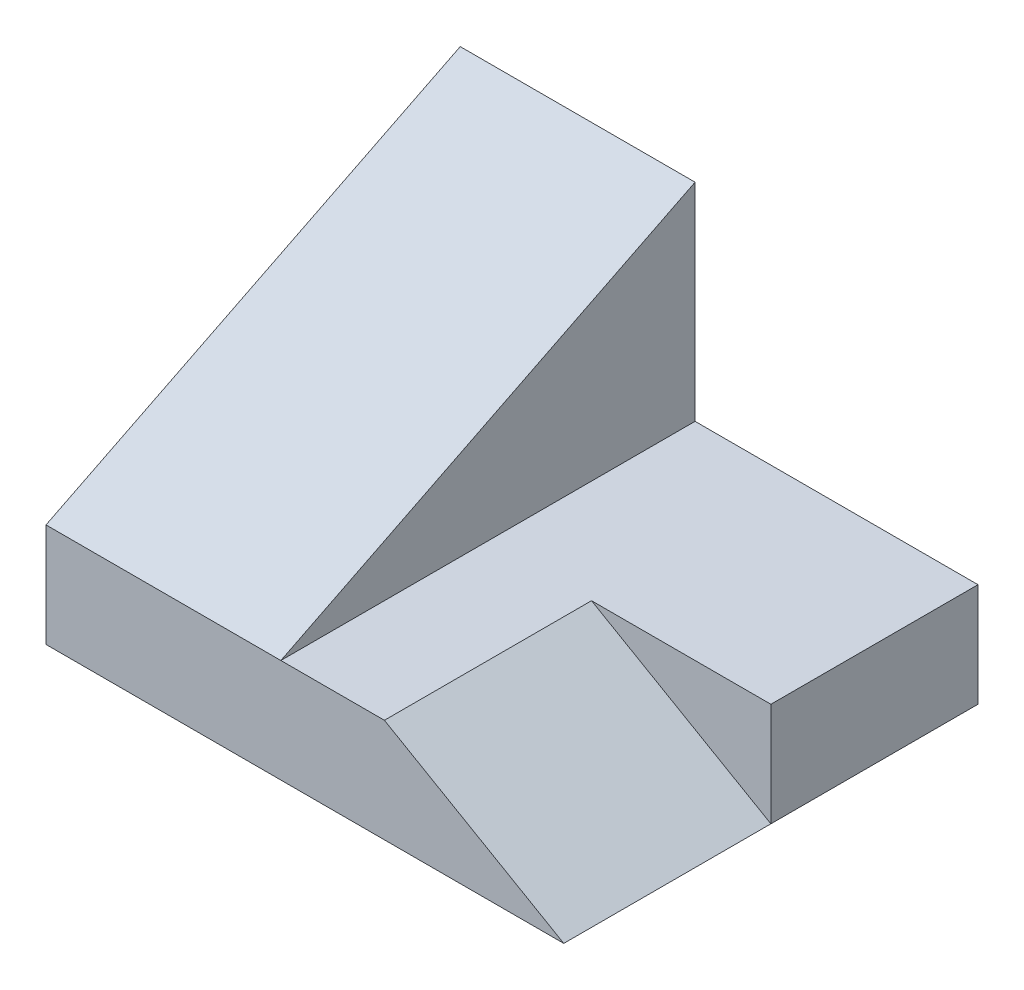
ISO-10303-21;
HEADER;
FILE_DESCRIPTION(('STEP AP214'),'2;1');
FILE_NAME('part.step','',(''),(''),'','','');
FILE_SCHEMA(('AUTOMOTIVE_DESIGN { 1 0 10303 214 1 1 1 1 }'));
ENDSEC;
DATA;
#1=APPLICATION_CONTEXT('core data for automotive mechanical design processes');
#2=APPLICATION_PROTOCOL_DEFINITION('international standard','automotive_design',2000,#1);
#3=PRODUCT_CONTEXT('',#1,'mechanical');
#4=PRODUCT('Part','Part','',(#3));
#5=PRODUCT_RELATED_PRODUCT_CATEGORY('part','',(#4));
#6=PRODUCT_DEFINITION_FORMATION('','',#4);
#7=PRODUCT_DEFINITION_CONTEXT('part definition',#1,'design');
#8=PRODUCT_DEFINITION('design','',#6,#7);
#9=PRODUCT_DEFINITION_SHAPE('','',#8);
#10=(LENGTH_UNIT() NAMED_UNIT(*) SI_UNIT(.MILLI.,.METRE.));
#11=(NAMED_UNIT(*) PLANE_ANGLE_UNIT() SI_UNIT($,.RADIAN.));
#12=(NAMED_UNIT(*) SI_UNIT($,.STERADIAN.) SOLID_ANGLE_UNIT());
#13=UNCERTAINTY_MEASURE_WITH_UNIT(LENGTH_MEASURE(1.E-05),#10,'distance_accuracy_value','');
#14=(GEOMETRIC_REPRESENTATION_CONTEXT(3) GLOBAL_UNCERTAINTY_ASSIGNED_CONTEXT((#13)) GLOBAL_UNIT_ASSIGNED_CONTEXT((#10,
#11,#12)) REPRESENTATION_CONTEXT('',''));
#15=CARTESIAN_POINT('',(0.,0.,0.));
#16=DIRECTION('',(0.,0.,1.));
#17=DIRECTION('',(1.,0.,0.));
#18=AXIS2_PLACEMENT_3D('',#15,#16,#17);
#19=CARTESIAN_POINT('',(0.,10.,-40.));
#20=DIRECTION('',(1.,0.,0.));
#21=DIRECTION('',(0.,0.,-1.));
#22=AXIS2_PLACEMENT_3D('',#19,#20,#21);
#23=PLANE('',#22);
#24=DIRECTION('',(0.,-1.,0.));
#25=VECTOR('',#24,1.);
#26=CARTESIAN_POINT('',(0.,10.,0.));
#27=LINE('',#26,#25);
#28=CARTESIAN_POINT('',(0.,10.,0.));
#29=VERTEX_POINT('',#28);
#30=CARTESIAN_POINT('',(0.,0.,0.));
#31=VERTEX_POINT('',#30);
#32=EDGE_CURVE('E11',#29,#31,#27,.T.);
#33=ORIENTED_EDGE('',*,*,#32,.F.);
#34=DIRECTION('',(0.,0.447213595499958,-0.894427190999916));
#35=VECTOR('',#34,1.);
#36=CARTESIAN_POINT('',(0.,26.,-32.));
#37=LINE('',#36,#35);
#38=CARTESIAN_POINT('',(0.,30.,-40.));
#39=VERTEX_POINT('',#38);
#40=EDGE_CURVE('E162',#29,#39,#37,.T.);
#41=ORIENTED_EDGE('',*,*,#40,.T.);
#42=DIRECTION('',(0.,-1.,0.));
#43=VECTOR('',#42,1.);
#44=CARTESIAN_POINT('',(0.,10.,-40.));
#45=LINE('',#44,#43);
#46=CARTESIAN_POINT('',(0.,0.,-40.));
#47=VERTEX_POINT('',#46);
#48=EDGE_CURVE('E91',#39,#47,#45,.T.);
#49=ORIENTED_EDGE('',*,*,#48,.T.);
#50=DIRECTION('',(0.,0.,1.));
#51=VECTOR('',#50,1.);
#52=CARTESIAN_POINT('',(0.,0.,-40.));
#53=LINE('',#52,#51);
#54=EDGE_CURVE('E96',#47,#31,#53,.T.);
#55=ORIENTED_EDGE('',*,*,#54,.T.);
#56=EDGE_LOOP('',(#33,#41,#49,#55));
#57=FACE_BOUND('',#56,.T.);
#58=ADVANCED_FACE('F39',(#57),#23,.F.);
#59=CARTESIAN_POINT('',(0.,10.,0.));
#60=DIRECTION('',(0.,0.,-1.));
#61=DIRECTION('',(-1.,0.,0.));
#62=AXIS2_PLACEMENT_3D('',#59,#60,#61);
#63=PLANE('',#62);
#64=DIRECTION('',(1.,0.,0.));
#65=VECTOR('',#64,1.);
#66=CARTESIAN_POINT('',(0.,10.,0.));
#67=LINE('',#66,#65);
#68=CARTESIAN_POINT('',(22.6794919243112,10.,0.));
#69=VERTEX_POINT('',#68);
#70=CARTESIAN_POINT('',(32.6794919243112,10.,0.));
#71=VERTEX_POINT('',#70);
#72=EDGE_CURVE('E97',#69,#71,#67,.T.);
#73=ORIENTED_EDGE('',*,*,#72,.F.);
#74=DIRECTION('',(1.,0.,0.));
#75=VECTOR('',#74,1.);
#76=CARTESIAN_POINT('',(-7.32050807568877,10.,0.));
#77=LINE('',#76,#75);
#78=EDGE_CURVE('E157',#29,#69,#77,.T.);
#79=ORIENTED_EDGE('',*,*,#78,.F.);
#80=ORIENTED_EDGE('',*,*,#32,.T.);
#81=DIRECTION('',(1.,0.,0.));
#82=VECTOR('',#81,1.);
#83=CARTESIAN_POINT('',(0.,0.,0.));
#84=LINE('',#83,#82);
#85=CARTESIAN_POINT('',(50.,0.,0.));
#86=VERTEX_POINT('',#85);
#87=EDGE_CURVE('E82',#31,#86,#84,.T.);
#88=ORIENTED_EDGE('',*,*,#87,.T.);
#89=DIRECTION('',(0.866025403784439,-0.5,0.));
#90=VECTOR('',#89,1.);
#91=CARTESIAN_POINT('',(32.6794919243112,10.,0.));
#92=LINE('',#91,#90);
#93=EDGE_CURVE('E118',#71,#86,#92,.T.);
#94=ORIENTED_EDGE('',*,*,#93,.F.);
#95=EDGE_LOOP('',(#73,#79,#80,#88,#94));
#96=FACE_BOUND('',#95,.T.);
#97=ADVANCED_FACE('F117',(#96),#63,.F.);
#98=CARTESIAN_POINT('',(50.,10.,0.));
#99=DIRECTION('',(-1.,0.,0.));
#100=DIRECTION('',(0.,0.,1.));
#101=AXIS2_PLACEMENT_3D('',#98,#99,#100);
#102=PLANE('',#101);
#103=DIRECTION('',(0.,0.,-1.));
#104=VECTOR('',#103,1.);
#105=CARTESIAN_POINT('',(50.,10.,0.));
#106=LINE('',#105,#104);
#107=CARTESIAN_POINT('',(50.,10.,-20.));
#108=VERTEX_POINT('',#107);
#109=CARTESIAN_POINT('',(50.,10.,-40.));
#110=VERTEX_POINT('',#109);
#111=EDGE_CURVE('E54',#108,#110,#106,.T.);
#112=ORIENTED_EDGE('',*,*,#111,.F.);
#113=DIRECTION('',(0.,1.,0.));
#114=VECTOR('',#113,1.);
#115=CARTESIAN_POINT('',(50.,0.,-20.));
#116=LINE('',#115,#114);
#117=CARTESIAN_POINT('',(50.,0.,-20.));
#118=VERTEX_POINT('',#117);
#119=EDGE_CURVE('E77',#118,#108,#116,.T.);
#120=ORIENTED_EDGE('',*,*,#119,.F.);
#121=DIRECTION('',(0.,0.,-1.));
#122=VECTOR('',#121,1.);
#123=CARTESIAN_POINT('',(50.,0.,0.));
#124=LINE('',#123,#122);
#125=CARTESIAN_POINT('',(50.,0.,-40.));
#126=VERTEX_POINT('',#125);
#127=EDGE_CURVE('E71',#118,#126,#124,.T.);
#128=ORIENTED_EDGE('',*,*,#127,.T.);
#129=DIRECTION('',(0.,-1.,0.));
#130=VECTOR('',#129,1.);
#131=CARTESIAN_POINT('',(50.,10.,-40.));
#132=LINE('',#131,#130);
#133=EDGE_CURVE('E47',#110,#126,#132,.T.);
#134=ORIENTED_EDGE('',*,*,#133,.F.);
#135=EDGE_LOOP('',(#112,#120,#128,#134));
#136=FACE_BOUND('',#135,.T.);
#137=ADVANCED_FACE('F73',(#136),#102,.F.);
#138=CARTESIAN_POINT('',(50.,10.,-40.));
#139=DIRECTION('',(0.,0.,1.));
#140=DIRECTION('',(1.,0.,0.));
#141=AXIS2_PLACEMENT_3D('',#138,#139,#140);
#142=PLANE('',#141);
#143=DIRECTION('',(-1.,0.,0.));
#144=VECTOR('',#143,1.);
#145=CARTESIAN_POINT('',(50.,0.,-40.));
#146=LINE('',#145,#144);
#147=EDGE_CURVE('E87',#126,#47,#146,.T.);
#148=ORIENTED_EDGE('',*,*,#147,.T.);
#149=ORIENTED_EDGE('',*,*,#48,.F.);
#150=DIRECTION('',(-1.,0.,0.));
#151=VECTOR('',#150,1.);
#152=CARTESIAN_POINT('',(0.,30.,-40.));
#153=LINE('',#152,#151);
#154=CARTESIAN_POINT('',(22.6794919243112,30.,-40.));
#155=VERTEX_POINT('',#154);
#156=EDGE_CURVE('E169',#155,#39,#153,.T.);
#157=ORIENTED_EDGE('',*,*,#156,.F.);
#158=DIRECTION('',(0.,-1.,0.));
#159=VECTOR('',#158,1.);
#160=CARTESIAN_POINT('',(22.6794919243112,30.,-40.));
#161=LINE('',#160,#159);
#162=CARTESIAN_POINT('',(22.6794919243112,10.,-40.));
#163=VERTEX_POINT('',#162);
#164=EDGE_CURVE('E140',#155,#163,#161,.T.);
#165=ORIENTED_EDGE('',*,*,#164,.T.);
#166=DIRECTION('',(-1.,0.,0.));
#167=VECTOR('',#166,1.);
#168=CARTESIAN_POINT('',(50.,10.,-40.));
#169=LINE('',#168,#167);
#170=EDGE_CURVE('E90',#110,#163,#169,.T.);
#171=ORIENTED_EDGE('',*,*,#170,.F.);
#172=ORIENTED_EDGE('',*,*,#133,.T.);
#173=EDGE_LOOP('',(#148,#149,#157,#165,#171,#172));
#174=FACE_BOUND('',#173,.T.);
#175=ADVANCED_FACE('F85',(#174),#142,.F.);
#176=CARTESIAN_POINT('',(0.,10.,0.));
#177=DIRECTION('',(0.,1.,0.));
#178=DIRECTION('',(0.,0.,1.));
#179=AXIS2_PLACEMENT_3D('',#176,#177,#178);
#180=PLANE('',#179);
#181=DIRECTION('',(0.,0.,-1.));
#182=VECTOR('',#181,1.);
#183=CARTESIAN_POINT('',(22.6794919243112,10.,-40.));
#184=LINE('',#183,#182);
#185=EDGE_CURVE('E166',#69,#163,#184,.T.);
#186=ORIENTED_EDGE('',*,*,#185,.F.);
#187=ORIENTED_EDGE('',*,*,#72,.T.);
#188=DIRECTION('',(0.,0.,1.));
#189=VECTOR('',#188,1.);
#190=CARTESIAN_POINT('',(32.6794919243112,10.,-20.));
#191=LINE('',#190,#189);
#192=CARTESIAN_POINT('',(32.6794919243112,10.,-20.));
#193=VERTEX_POINT('',#192);
#194=EDGE_CURVE('E112',#193,#71,#191,.T.);
#195=ORIENTED_EDGE('',*,*,#194,.F.);
#196=DIRECTION('',(-1.,0.,0.));
#197=VECTOR('',#196,1.);
#198=CARTESIAN_POINT('',(50.,10.,-20.));
#199=LINE('',#198,#197);
#200=EDGE_CURVE('E132',#108,#193,#199,.T.);
#201=ORIENTED_EDGE('',*,*,#200,.F.);
#202=ORIENTED_EDGE('',*,*,#111,.T.);
#203=ORIENTED_EDGE('',*,*,#170,.T.);
#204=EDGE_LOOP('',(#186,#187,#195,#201,#202,#203));
#205=FACE_BOUND('',#204,.T.);
#206=ADVANCED_FACE('F142',(#205),#180,.T.);
#207=CARTESIAN_POINT('',(0.,0.,0.));
#208=DIRECTION('',(0.,1.,0.));
#209=DIRECTION('',(0.,0.,1.));
#210=AXIS2_PLACEMENT_3D('',#207,#208,#209);
#211=PLANE('',#210);
#212=ORIENTED_EDGE('',*,*,#54,.F.);
#213=ORIENTED_EDGE('',*,*,#147,.F.);
#214=ORIENTED_EDGE('',*,*,#127,.F.);
#215=EDGE_CURVE('E81',#86,#118,#124,.T.);
#216=ORIENTED_EDGE('',*,*,#215,.F.);
#217=ORIENTED_EDGE('',*,*,#87,.F.);
#218=EDGE_LOOP('',(#212,#213,#214,#216,#217));
#219=FACE_BOUND('',#218,.T.);
#220=ADVANCED_FACE('F93',(#219),#211,.F.);
#221=CARTESIAN_POINT('',(32.6794919243112,10.,-20.));
#222=DIRECTION('',(-0.5,-0.866025403784439,0.));
#223=DIRECTION('',(0.866025403784439,-0.5,0.));
#224=AXIS2_PLACEMENT_3D('',#221,#222,#223);
#225=PLANE('',#224);
#226=ORIENTED_EDGE('',*,*,#93,.T.);
#227=ORIENTED_EDGE('',*,*,#215,.T.);
#228=DIRECTION('',(0.866025403784439,-0.5,0.));
#229=VECTOR('',#228,1.);
#230=CARTESIAN_POINT('',(32.6794919243112,10.,-20.));
#231=LINE('',#230,#229);
#232=EDGE_CURVE('E127',#193,#118,#231,.T.);
#233=ORIENTED_EDGE('',*,*,#232,.F.);
#234=ORIENTED_EDGE('',*,*,#194,.T.);
#235=EDGE_LOOP('',(#226,#227,#233,#234));
#236=FACE_BOUND('',#235,.T.);
#237=ADVANCED_FACE('F124',(#236),#225,.F.);
#238=CARTESIAN_POINT('',(0.,0.,-20.));
#239=DIRECTION('',(0.,0.,-1.));
#240=DIRECTION('',(-1.,0.,0.));
#241=AXIS2_PLACEMENT_3D('',#238,#239,#240);
#242=PLANE('',#241);
#243=ORIENTED_EDGE('',*,*,#200,.T.);
#244=ORIENTED_EDGE('',*,*,#232,.T.);
#245=ORIENTED_EDGE('',*,*,#119,.T.);
#246=EDGE_LOOP('',(#243,#244,#245));
#247=FACE_BOUND('',#246,.T.);
#248=ADVANCED_FACE('F131',(#247),#242,.F.);
#249=CARTESIAN_POINT('',(22.6794919243112,30.,-40.));
#250=DIRECTION('',(-1.,0.,0.));
#251=DIRECTION('',(0.,0.,1.));
#252=AXIS2_PLACEMENT_3D('',#249,#250,#251);
#253=PLANE('',#252);
#254=ORIENTED_EDGE('',*,*,#164,.F.);
#255=DIRECTION('',(0.,0.447213595499958,-0.894427190999916));
#256=VECTOR('',#255,1.);
#257=CARTESIAN_POINT('',(22.6794919243112,30.,-40.));
#258=LINE('',#257,#256);
#259=EDGE_CURVE('E160',#69,#155,#258,.T.);
#260=ORIENTED_EDGE('',*,*,#259,.F.);
#261=ORIENTED_EDGE('',*,*,#185,.T.);
#262=EDGE_LOOP('',(#254,#260,#261));
#263=FACE_BOUND('',#262,.T.);
#264=ADVANCED_FACE('F165',(#263),#253,.F.);
#265=CARTESIAN_POINT('',(-7.32050807568877,30.,-40.));
#266=DIRECTION('',(0.,-0.894427190999916,-0.447213595499958));
#267=DIRECTION('',(0.,0.447213595499958,-0.894427190999916));
#268=AXIS2_PLACEMENT_3D('',#265,#266,#267);
#269=PLANE('',#268);
#270=ORIENTED_EDGE('',*,*,#78,.T.);
#271=ORIENTED_EDGE('',*,*,#259,.T.);
#272=ORIENTED_EDGE('',*,*,#156,.T.);
#273=ORIENTED_EDGE('',*,*,#40,.F.);
#274=EDGE_LOOP('',(#270,#271,#272,#273));
#275=FACE_BOUND('',#274,.T.);
#276=ADVANCED_FACE('F159',(#275),#269,.F.);
#277=CLOSED_SHELL('',(#58,#97,#137,#175,#206,#220,#237,#248,#264,#276));
#278=MANIFOLD_SOLID_BREP('B2',#277);
#279=ADVANCED_BREP_SHAPE_REPRESENTATION('',(#18,#278),#14);
#280=SHAPE_DEFINITION_REPRESENTATION(#9,#279);
ENDSEC;
END-ISO-10303-21;
